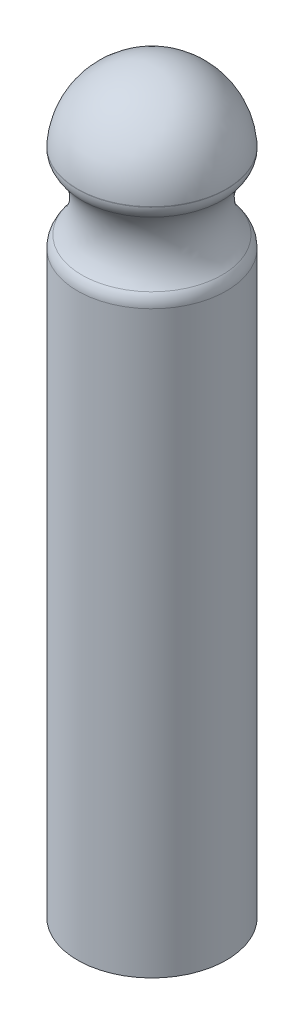
ISO-10303-21;
HEADER;
FILE_DESCRIPTION(('STEP AP214'),'2;1');
FILE_NAME('part.step','',(''),(''),'','','');
FILE_SCHEMA(('AUTOMOTIVE_DESIGN { 1 0 10303 214 1 1 1 1 }'));
ENDSEC;
DATA;
#1=APPLICATION_CONTEXT('core data for automotive mechanical design processes');
#2=APPLICATION_PROTOCOL_DEFINITION('international standard','automotive_design',2000,#1);
#3=PRODUCT_CONTEXT('',#1,'mechanical');
#4=PRODUCT('Part','Part','',(#3));
#5=PRODUCT_RELATED_PRODUCT_CATEGORY('part','',(#4));
#6=PRODUCT_DEFINITION_FORMATION('','',#4);
#7=PRODUCT_DEFINITION_CONTEXT('part definition',#1,'design');
#8=PRODUCT_DEFINITION('design','',#6,#7);
#9=PRODUCT_DEFINITION_SHAPE('','',#8);
#10=(LENGTH_UNIT() NAMED_UNIT(*) SI_UNIT(.MILLI.,.METRE.));
#11=(NAMED_UNIT(*) PLANE_ANGLE_UNIT() SI_UNIT($,.RADIAN.));
#12=(NAMED_UNIT(*) SI_UNIT($,.STERADIAN.) SOLID_ANGLE_UNIT());
#13=UNCERTAINTY_MEASURE_WITH_UNIT(LENGTH_MEASURE(1.E-05),#10,'distance_accuracy_value','');
#14=(GEOMETRIC_REPRESENTATION_CONTEXT(3) GLOBAL_UNCERTAINTY_ASSIGNED_CONTEXT((#13)) GLOBAL_UNIT_ASSIGNED_CONTEXT((#10,
#11,#12)) REPRESENTATION_CONTEXT('',''));
#15=CARTESIAN_POINT('',(0.,0.,0.));
#16=DIRECTION('',(0.,0.,1.));
#17=DIRECTION('',(1.,0.,0.));
#18=AXIS2_PLACEMENT_3D('',#15,#16,#17);
#19=CARTESIAN_POINT('',(0.,55.6020254568321,0.));
#20=DIRECTION('',(0.,1.,0.));
#21=DIRECTION('',(1.,0.,0.));
#22=AXIS2_PLACEMENT_3D('',#19,#20,#21);
#23=SPHERICAL_SURFACE('',#22,6.25258474987199);
#24=CARTESIAN_POINT('',(0.,55.9985302541949,0.));
#25=DIRECTION('',(0.,1.,0.));
#26=DIRECTION('',(-1.,0.,0.));
#27=AXIS2_PLACEMENT_3D('',#24,#25,#26);
#28=CIRCLE('',#27,6.24000000000001);
#29=CARTESIAN_POINT('',(-6.24000000000001,55.9985302541949,0.));
#30=VERTEX_POINT('',#29);
#31=EDGE_CURVE('E10',#30,#30,#28,.T.);
#32=ORIENTED_EDGE('',*,*,#31,.T.);
#33=EDGE_LOOP('',(#32));
#34=FACE_BOUND('',#33,.T.);
#35=ADVANCED_FACE('F31',(#34),#23,.T.);
#36=CARTESIAN_POINT('',(0.,61.8546102067041,0.));
#37=DIRECTION('',(0.,1.,0.));
#38=DIRECTION('',(-1.,0.,0.));
#39=AXIS2_PLACEMENT_3D('',#36,#37,#38);
#40=CYLINDRICAL_SURFACE('',#39,6.24000000000001);
#41=ORIENTED_EDGE('',*,*,#31,.F.);
#42=EDGE_LOOP('',(#41));
#43=FACE_BOUND('',#42,.T.);
#44=CARTESIAN_POINT('',(0.,55.9591098101006,0.));
#45=DIRECTION('',(0.,1.,0.));
#46=DIRECTION('',(-1.,0.,0.));
#47=AXIS2_PLACEMENT_3D('',#44,#45,#46);
#48=CIRCLE('',#47,6.24000000000001);
#49=CARTESIAN_POINT('',(-6.24000000000002,55.9591098101006,0.));
#50=VERTEX_POINT('',#49);
#51=EDGE_CURVE('E37',#50,#50,#48,.T.);
#52=ORIENTED_EDGE('',*,*,#51,.T.);
#53=EDGE_LOOP('',(#52));
#54=FACE_BOUND('',#53,.T.);
#55=ADVANCED_FACE('F69',(#43,#54),#40,.T.);
#56=CARTESIAN_POINT('',(0.,55.9591098101006,0.));
#57=DIRECTION('',(0.,1.,0.));
#58=DIRECTION('',(-1.,0.,0.));
#59=AXIS2_PLACEMENT_3D('',#56,#57,#58);
#60=TOROIDAL_SURFACE('',#59,4.74000000000001,1.5);
#61=ORIENTED_EDGE('',*,*,#51,.F.);
#62=EDGE_LOOP('',(#61));
#63=FACE_BOUND('',#62,.T.);
#64=CARTESIAN_POINT('',(0.,54.9817582475647,0.));
#65=DIRECTION('',(0.,1.,0.));
#66=DIRECTION('',(-1.,0.,0.));
#67=AXIS2_PLACEMENT_3D('',#64,#65,#66);
#68=CIRCLE('',#67,5.87788572502191);
#69=CARTESIAN_POINT('',(-5.87788572502192,54.9817582475647,0.));
#70=VERTEX_POINT('',#69);
#71=EDGE_CURVE('E41',#70,#70,#68,.T.);
#72=ORIENTED_EDGE('',*,*,#71,.T.);
#73=EDGE_LOOP('',(#72));
#74=FACE_BOUND('',#73,.T.);
#75=ADVANCED_FACE('F73',(#63,#74),#60,.T.);
#76=CARTESIAN_POINT('',(0.,52.2737964891522,0.));
#77=DIRECTION('',(0.,1.,0.));
#78=DIRECTION('',(-1.,0.,0.));
#79=AXIS2_PLACEMENT_3D('',#76,#77,#78);
#80=TOROIDAL_SURFACE('',#79,9.03064175153062,4.15607115527532);
#81=ORIENTED_EDGE('',*,*,#71,.F.);
#82=EDGE_LOOP('',(#81));
#83=FACE_BOUND('',#82,.T.);
#84=CARTESIAN_POINT('',(0.,49.5658347307397,0.));
#85=DIRECTION('',(0.,1.,0.));
#86=DIRECTION('',(-1.,0.,0.));
#87=AXIS2_PLACEMENT_3D('',#84,#85,#86);
#88=CIRCLE('',#87,5.87788572502191);
#89=CARTESIAN_POINT('',(-5.87788572502192,49.5658347307397,0.));
#90=VERTEX_POINT('',#89);
#91=EDGE_CURVE('E45',#90,#90,#88,.T.);
#92=ORIENTED_EDGE('',*,*,#91,.T.);
#93=EDGE_LOOP('',(#92));
#94=FACE_BOUND('',#93,.T.);
#95=ADVANCED_FACE('F78',(#83,#94),#80,.F.);
#96=CARTESIAN_POINT('',(0.,48.5884831682038,0.));
#97=DIRECTION('',(0.,1.,0.));
#98=DIRECTION('',(-1.,0.,0.));
#99=AXIS2_PLACEMENT_3D('',#96,#97,#98);
#100=TOROIDAL_SURFACE('',#99,4.74000000000001,1.5);
#101=ORIENTED_EDGE('',*,*,#91,.F.);
#102=EDGE_LOOP('',(#101));
#103=FACE_BOUND('',#102,.T.);
#104=CARTESIAN_POINT('',(0.,48.5884831682038,0.));
#105=DIRECTION('',(0.,1.,0.));
#106=DIRECTION('',(-1.,0.,0.));
#107=AXIS2_PLACEMENT_3D('',#104,#105,#106);
#108=CIRCLE('',#107,6.24000000000001);
#109=CARTESIAN_POINT('',(-6.24000000000001,48.5884831682038,0.));
#110=VERTEX_POINT('',#109);
#111=EDGE_CURVE('E50',#110,#110,#108,.T.);
#112=ORIENTED_EDGE('',*,*,#111,.T.);
#113=EDGE_LOOP('',(#112));
#114=FACE_BOUND('',#113,.T.);
#115=ADVANCED_FACE('F65',(#103,#114),#100,.T.);
#116=CARTESIAN_POINT('',(0.,61.8546102067041,0.));
#117=DIRECTION('',(0.,1.,0.));
#118=DIRECTION('',(-1.,0.,0.));
#119=AXIS2_PLACEMENT_3D('',#116,#117,#118);
#120=CYLINDRICAL_SURFACE('',#119,6.24);
#121=ORIENTED_EDGE('',*,*,#111,.F.);
#122=EDGE_LOOP('',(#121));
#123=FACE_BOUND('',#122,.T.);
#124=CARTESIAN_POINT('',(0.,0.,0.));
#125=DIRECTION('',(0.,1.,0.));
#126=DIRECTION('',(-1.,0.,0.));
#127=AXIS2_PLACEMENT_3D('',#124,#125,#126);
#128=CIRCLE('',#127,6.24);
#129=CARTESIAN_POINT('',(-6.24,0.,0.));
#130=VERTEX_POINT('',#129);
#131=EDGE_CURVE('E53',#130,#130,#128,.T.);
#132=ORIENTED_EDGE('',*,*,#131,.T.);
#133=EDGE_LOOP('',(#132));
#134=FACE_BOUND('',#133,.T.);
#135=ADVANCED_FACE('F57',(#123,#134),#120,.T.);
#136=CARTESIAN_POINT('',(0.,0.,0.));
#137=DIRECTION('',(0.,1.,0.));
#138=DIRECTION('',(-1.,0.,0.));
#139=AXIS2_PLACEMENT_3D('',#136,#137,#138);
#140=PLANE('',#139);
#141=ORIENTED_EDGE('',*,*,#131,.F.);
#142=EDGE_LOOP('',(#141));
#143=FACE_BOUND('',#142,.T.);
#144=ADVANCED_FACE('F59',(#143),#140,.F.);
#145=CLOSED_SHELL('',(#35,#55,#75,#95,#115,#135,#144));
#146=MANIFOLD_SOLID_BREP('B2',#145);
#147=ADVANCED_BREP_SHAPE_REPRESENTATION('',(#18,#146),#14);
#148=SHAPE_DEFINITION_REPRESENTATION(#9,#147);
ENDSEC;
END-ISO-10303-21;
